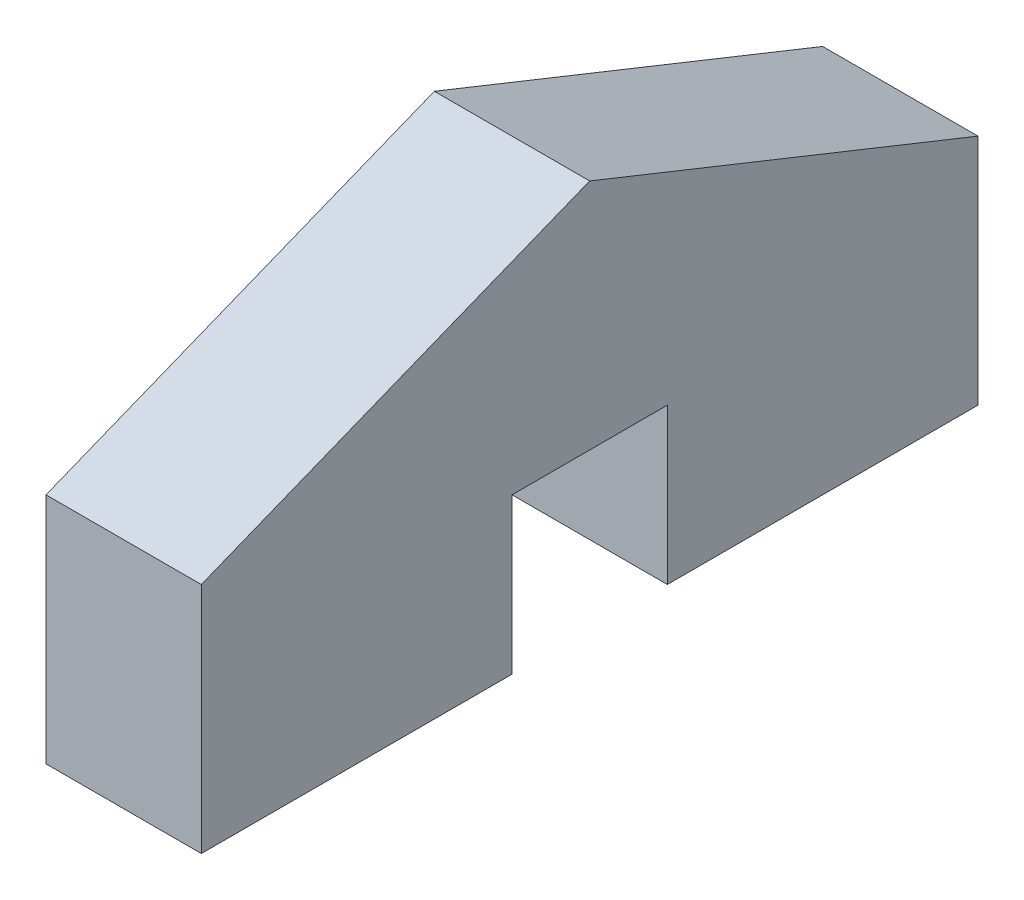
ISO-10303-21;
HEADER;
FILE_DESCRIPTION(('STEP AP214'),'2;1');
FILE_NAME('part.step','',(''),(''),'','','');
FILE_SCHEMA(('AUTOMOTIVE_DESIGN { 1 0 10303 214 1 1 1 1 }'));
ENDSEC;
DATA;
#1=APPLICATION_CONTEXT('core data for automotive mechanical design processes');
#2=APPLICATION_PROTOCOL_DEFINITION('international standard','automotive_design',2000,#1);
#3=PRODUCT_CONTEXT('',#1,'mechanical');
#4=PRODUCT('Part','Part','',(#3));
#5=PRODUCT_RELATED_PRODUCT_CATEGORY('part','',(#4));
#6=PRODUCT_DEFINITION_FORMATION('','',#4);
#7=PRODUCT_DEFINITION_CONTEXT('part definition',#1,'design');
#8=PRODUCT_DEFINITION('design','',#6,#7);
#9=PRODUCT_DEFINITION_SHAPE('','',#8);
#10=(LENGTH_UNIT() NAMED_UNIT(*) SI_UNIT(.MILLI.,.METRE.));
#11=(NAMED_UNIT(*) PLANE_ANGLE_UNIT() SI_UNIT($,.RADIAN.));
#12=(NAMED_UNIT(*) SI_UNIT($,.STERADIAN.) SOLID_ANGLE_UNIT());
#13=UNCERTAINTY_MEASURE_WITH_UNIT(LENGTH_MEASURE(1.E-05),#10,'distance_accuracy_value','');
#14=(GEOMETRIC_REPRESENTATION_CONTEXT(3) GLOBAL_UNCERTAINTY_ASSIGNED_CONTEXT((#13)) GLOBAL_UNIT_ASSIGNED_CONTEXT((#10,
#11,#12)) REPRESENTATION_CONTEXT('',''));
#15=CARTESIAN_POINT('',(0.,0.,0.));
#16=DIRECTION('',(0.,0.,1.));
#17=DIRECTION('',(1.,0.,0.));
#18=AXIS2_PLACEMENT_3D('',#15,#16,#17);
#19=CARTESIAN_POINT('',(20.,0.,0.));
#20=DIRECTION('',(0.,0.,-1.));
#21=DIRECTION('',(-1.,0.,0.));
#22=AXIS2_PLACEMENT_3D('',#19,#20,#21);
#23=PLANE('',#22);
#24=DIRECTION('',(0.,-1.,0.));
#25=VECTOR('',#24,1.);
#26=CARTESIAN_POINT('',(0.,0.,0.));
#27=LINE('',#26,#25);
#28=CARTESIAN_POINT('',(0.,30.,0.));
#29=VERTEX_POINT('',#28);
#30=CARTESIAN_POINT('',(0.,0.,0.));
#31=VERTEX_POINT('',#30);
#32=EDGE_CURVE('E134',#29,#31,#27,.T.);
#33=ORIENTED_EDGE('',*,*,#32,.T.);
#34=DIRECTION('',(-1.,0.,0.));
#35=VECTOR('',#34,1.);
#36=CARTESIAN_POINT('',(20.,0.,0.));
#37=LINE('',#36,#35);
#38=CARTESIAN_POINT('',(20.,0.,0.));
#39=VERTEX_POINT('',#38);
#40=EDGE_CURVE('E11',#39,#31,#37,.T.);
#41=ORIENTED_EDGE('',*,*,#40,.F.);
#42=DIRECTION('',(0.,-1.,0.));
#43=VECTOR('',#42,1.);
#44=CARTESIAN_POINT('',(20.,0.,0.));
#45=LINE('',#44,#43);
#46=CARTESIAN_POINT('',(20.,30.,0.));
#47=VERTEX_POINT('',#46);
#48=EDGE_CURVE('E150',#47,#39,#45,.T.);
#49=ORIENTED_EDGE('',*,*,#48,.F.);
#50=DIRECTION('',(-1.,0.,0.));
#51=VECTOR('',#50,1.);
#52=CARTESIAN_POINT('',(20.,30.,0.));
#53=LINE('',#52,#51);
#54=EDGE_CURVE('E130',#47,#29,#53,.T.);
#55=ORIENTED_EDGE('',*,*,#54,.T.);
#56=EDGE_LOOP('',(#33,#41,#49,#55));
#57=FACE_BOUND('',#56,.T.);
#58=ADVANCED_FACE('F32',(#57),#23,.F.);
#59=CARTESIAN_POINT('',(20.,0.,0.));
#60=DIRECTION('',(0.,1.,0.));
#61=DIRECTION('',(0.,0.,1.));
#62=AXIS2_PLACEMENT_3D('',#59,#60,#61);
#63=PLANE('',#62);
#64=DIRECTION('',(0.,0.,-1.));
#65=VECTOR('',#64,1.);
#66=CARTESIAN_POINT('',(0.,0.,0.));
#67=LINE('',#66,#65);
#68=CARTESIAN_POINT('',(0.,0.,-40.));
#69=VERTEX_POINT('',#68);
#70=EDGE_CURVE('E137',#31,#69,#67,.T.);
#71=ORIENTED_EDGE('',*,*,#70,.T.);
#72=DIRECTION('',(-1.,0.,0.));
#73=VECTOR('',#72,1.);
#74=CARTESIAN_POINT('',(20.,0.,-40.));
#75=LINE('',#74,#73);
#76=CARTESIAN_POINT('',(20.,0.,-40.));
#77=VERTEX_POINT('',#76);
#78=EDGE_CURVE('E40',#77,#69,#75,.T.);
#79=ORIENTED_EDGE('',*,*,#78,.F.);
#80=DIRECTION('',(0.,0.,-1.));
#81=VECTOR('',#80,1.);
#82=CARTESIAN_POINT('',(20.,0.,0.));
#83=LINE('',#82,#81);
#84=EDGE_CURVE('E94',#39,#77,#83,.T.);
#85=ORIENTED_EDGE('',*,*,#84,.F.);
#86=ORIENTED_EDGE('',*,*,#40,.T.);
#87=EDGE_LOOP('',(#71,#79,#85,#86));
#88=FACE_BOUND('',#87,.T.);
#89=ADVANCED_FACE('F193',(#88),#63,.F.);
#90=CARTESIAN_POINT('',(20.,0.,-40.));
#91=DIRECTION('',(0.,0.,1.));
#92=DIRECTION('',(1.,0.,0.));
#93=AXIS2_PLACEMENT_3D('',#90,#91,#92);
#94=PLANE('',#93);
#95=DIRECTION('',(0.,1.,0.));
#96=VECTOR('',#95,1.);
#97=CARTESIAN_POINT('',(0.,0.,-40.));
#98=LINE('',#97,#96);
#99=CARTESIAN_POINT('',(0.,20.,-40.));
#100=VERTEX_POINT('',#99);
#101=EDGE_CURVE('E139',#69,#100,#98,.T.);
#102=ORIENTED_EDGE('',*,*,#101,.T.);
#103=DIRECTION('',(-1.,0.,0.));
#104=VECTOR('',#103,1.);
#105=CARTESIAN_POINT('',(20.,20.,-40.));
#106=LINE('',#105,#104);
#107=CARTESIAN_POINT('',(20.,20.,-40.));
#108=VERTEX_POINT('',#107);
#109=EDGE_CURVE('E160',#108,#100,#106,.T.);
#110=ORIENTED_EDGE('',*,*,#109,.F.);
#111=DIRECTION('',(0.,1.,0.));
#112=VECTOR('',#111,1.);
#113=CARTESIAN_POINT('',(20.,0.,-40.));
#114=LINE('',#113,#112);
#115=EDGE_CURVE('E168',#77,#108,#114,.T.);
#116=ORIENTED_EDGE('',*,*,#115,.F.);
#117=ORIENTED_EDGE('',*,*,#78,.T.);
#118=EDGE_LOOP('',(#102,#110,#116,#117));
#119=FACE_BOUND('',#118,.T.);
#120=ADVANCED_FACE('F166',(#119),#94,.F.);
#121=CARTESIAN_POINT('',(20.,20.,-40.));
#122=DIRECTION('',(0.,1.,0.));
#123=DIRECTION('',(0.,0.,1.));
#124=AXIS2_PLACEMENT_3D('',#121,#122,#123);
#125=PLANE('',#124);
#126=DIRECTION('',(0.,0.,-1.));
#127=VECTOR('',#126,1.);
#128=CARTESIAN_POINT('',(0.,20.,-40.));
#129=LINE('',#128,#127);
#130=CARTESIAN_POINT('',(0.,20.,-60.));
#131=VERTEX_POINT('',#130);
#132=EDGE_CURVE('E141',#100,#131,#129,.T.);
#133=ORIENTED_EDGE('',*,*,#132,.T.);
#134=DIRECTION('',(-1.,0.,0.));
#135=VECTOR('',#134,1.);
#136=CARTESIAN_POINT('',(20.,20.,-60.));
#137=LINE('',#136,#135);
#138=CARTESIAN_POINT('',(20.,20.,-60.));
#139=VERTEX_POINT('',#138);
#140=EDGE_CURVE('E157',#139,#131,#137,.T.);
#141=ORIENTED_EDGE('',*,*,#140,.F.);
#142=DIRECTION('',(0.,0.,-1.));
#143=VECTOR('',#142,1.);
#144=CARTESIAN_POINT('',(20.,20.,-40.));
#145=LINE('',#144,#143);
#146=EDGE_CURVE('E184',#108,#139,#145,.T.);
#147=ORIENTED_EDGE('',*,*,#146,.F.);
#148=ORIENTED_EDGE('',*,*,#109,.T.);
#149=EDGE_LOOP('',(#133,#141,#147,#148));
#150=FACE_BOUND('',#149,.T.);
#151=ADVANCED_FACE('F177',(#150),#125,.F.);
#152=CARTESIAN_POINT('',(20.,0.,-60.));
#153=DIRECTION('',(0.,0.,-1.));
#154=DIRECTION('',(-1.,0.,0.));
#155=AXIS2_PLACEMENT_3D('',#152,#153,#154);
#156=PLANE('',#155);
#157=DIRECTION('',(0.,-1.,0.));
#158=VECTOR('',#157,1.);
#159=CARTESIAN_POINT('',(0.,0.,-60.));
#160=LINE('',#159,#158);
#161=CARTESIAN_POINT('',(0.,0.,-60.));
#162=VERTEX_POINT('',#161);
#163=EDGE_CURVE('E143',#131,#162,#160,.T.);
#164=ORIENTED_EDGE('',*,*,#163,.T.);
#165=DIRECTION('',(-1.,0.,0.));
#166=VECTOR('',#165,1.);
#167=CARTESIAN_POINT('',(20.,0.,-60.));
#168=LINE('',#167,#166);
#169=CARTESIAN_POINT('',(20.,0.,-60.));
#170=VERTEX_POINT('',#169);
#171=EDGE_CURVE('E154',#170,#162,#168,.T.);
#172=ORIENTED_EDGE('',*,*,#171,.F.);
#173=DIRECTION('',(0.,-1.,0.));
#174=VECTOR('',#173,1.);
#175=CARTESIAN_POINT('',(20.,0.,-60.));
#176=LINE('',#175,#174);
#177=EDGE_CURVE('E183',#139,#170,#176,.T.);
#178=ORIENTED_EDGE('',*,*,#177,.F.);
#179=ORIENTED_EDGE('',*,*,#140,.T.);
#180=EDGE_LOOP('',(#164,#172,#178,#179));
#181=FACE_BOUND('',#180,.T.);
#182=ADVANCED_FACE('F181',(#181),#156,.F.);
#183=CARTESIAN_POINT('',(20.,0.,-60.));
#184=DIRECTION('',(0.,1.,0.));
#185=DIRECTION('',(0.,0.,1.));
#186=AXIS2_PLACEMENT_3D('',#183,#184,#185);
#187=PLANE('',#186);
#188=DIRECTION('',(0.,0.,-1.));
#189=VECTOR('',#188,1.);
#190=CARTESIAN_POINT('',(0.,0.,-60.));
#191=LINE('',#190,#189);
#192=CARTESIAN_POINT('',(0.,0.,-100.));
#193=VERTEX_POINT('',#192);
#194=EDGE_CURVE('E145',#162,#193,#191,.T.);
#195=ORIENTED_EDGE('',*,*,#194,.T.);
#196=DIRECTION('',(-1.,0.,0.));
#197=VECTOR('',#196,1.);
#198=CARTESIAN_POINT('',(20.,0.,-100.));
#199=LINE('',#198,#197);
#200=CARTESIAN_POINT('',(20.,0.,-100.));
#201=VERTEX_POINT('',#200);
#202=EDGE_CURVE('E125',#201,#193,#199,.T.);
#203=ORIENTED_EDGE('',*,*,#202,.F.);
#204=DIRECTION('',(0.,0.,-1.));
#205=VECTOR('',#204,1.);
#206=CARTESIAN_POINT('',(20.,0.,-60.));
#207=LINE('',#206,#205);
#208=EDGE_CURVE('E116',#170,#201,#207,.T.);
#209=ORIENTED_EDGE('',*,*,#208,.F.);
#210=ORIENTED_EDGE('',*,*,#171,.T.);
#211=EDGE_LOOP('',(#195,#203,#209,#210));
#212=FACE_BOUND('',#211,.T.);
#213=ADVANCED_FACE('F205',(#212),#187,.F.);
#214=CARTESIAN_POINT('',(20.,0.,-100.));
#215=DIRECTION('',(0.,0.,1.));
#216=DIRECTION('',(1.,0.,0.));
#217=AXIS2_PLACEMENT_3D('',#214,#215,#216);
#218=PLANE('',#217);
#219=DIRECTION('',(0.,1.,0.));
#220=VECTOR('',#219,1.);
#221=CARTESIAN_POINT('',(0.,0.,-100.));
#222=LINE('',#221,#220);
#223=CARTESIAN_POINT('',(0.,30.,-100.));
#224=VERTEX_POINT('',#223);
#225=EDGE_CURVE('E124',#193,#224,#222,.T.);
#226=ORIENTED_EDGE('',*,*,#225,.T.);
#227=DIRECTION('',(-1.,0.,0.));
#228=VECTOR('',#227,1.);
#229=CARTESIAN_POINT('',(20.,30.,-100.));
#230=LINE('',#229,#228);
#231=CARTESIAN_POINT('',(20.,30.,-100.));
#232=VERTEX_POINT('',#231);
#233=EDGE_CURVE('E121',#232,#224,#230,.T.);
#234=ORIENTED_EDGE('',*,*,#233,.F.);
#235=DIRECTION('',(0.,1.,0.));
#236=VECTOR('',#235,1.);
#237=CARTESIAN_POINT('',(20.,0.,-100.));
#238=LINE('',#237,#236);
#239=EDGE_CURVE('E110',#201,#232,#238,.T.);
#240=ORIENTED_EDGE('',*,*,#239,.F.);
#241=ORIENTED_EDGE('',*,*,#202,.T.);
#242=EDGE_LOOP('',(#226,#234,#240,#241));
#243=FACE_BOUND('',#242,.T.);
#244=ADVANCED_FACE('F122',(#243),#218,.F.);
#245=CARTESIAN_POINT('',(20.,50.,-50.));
#246=DIRECTION('',(0.,-0.928476690885259,0.371390676354104));
#247=DIRECTION('',(0.,-0.371390676354104,-0.928476690885259));
#248=AXIS2_PLACEMENT_3D('',#245,#246,#247);
#249=PLANE('',#248);
#250=DIRECTION('',(0.,0.371390676354104,0.928476690885259));
#251=VECTOR('',#250,1.);
#252=CARTESIAN_POINT('',(0.,50.,-50.));
#253=LINE('',#252,#251);
#254=CARTESIAN_POINT('',(0.,50.,-50.));
#255=VERTEX_POINT('',#254);
#256=EDGE_CURVE('E80',#224,#255,#253,.T.);
#257=ORIENTED_EDGE('',*,*,#256,.T.);
#258=DIRECTION('',(-1.,0.,0.));
#259=VECTOR('',#258,1.);
#260=CARTESIAN_POINT('',(20.,50.,-50.));
#261=LINE('',#260,#259);
#262=CARTESIAN_POINT('',(20.,50.,-50.));
#263=VERTEX_POINT('',#262);
#264=EDGE_CURVE('E126',#263,#255,#261,.T.);
#265=ORIENTED_EDGE('',*,*,#264,.F.);
#266=DIRECTION('',(0.,0.371390676354104,0.928476690885259));
#267=VECTOR('',#266,1.);
#268=CARTESIAN_POINT('',(20.,50.,-50.));
#269=LINE('',#268,#267);
#270=EDGE_CURVE('E114',#232,#263,#269,.T.);
#271=ORIENTED_EDGE('',*,*,#270,.F.);
#272=ORIENTED_EDGE('',*,*,#233,.T.);
#273=EDGE_LOOP('',(#257,#265,#271,#272));
#274=FACE_BOUND('',#273,.T.);
#275=ADVANCED_FACE('F128',(#274),#249,.F.);
#276=CARTESIAN_POINT('',(20.,50.,-50.));
#277=DIRECTION('',(0.,-0.928476690885259,-0.371390676354104));
#278=DIRECTION('',(0.,0.371390676354104,-0.928476690885259));
#279=AXIS2_PLACEMENT_3D('',#276,#277,#278);
#280=PLANE('',#279);
#281=DIRECTION('',(0.,-0.371390676354104,0.928476690885259));
#282=VECTOR('',#281,1.);
#283=CARTESIAN_POINT('',(0.,50.,-50.));
#284=LINE('',#283,#282);
#285=EDGE_CURVE('E86',#255,#29,#284,.T.);
#286=ORIENTED_EDGE('',*,*,#285,.T.);
#287=ORIENTED_EDGE('',*,*,#54,.F.);
#288=DIRECTION('',(0.,-0.371390676354104,0.928476690885259));
#289=VECTOR('',#288,1.);
#290=CARTESIAN_POINT('',(20.,50.,-50.));
#291=LINE('',#290,#289);
#292=EDGE_CURVE('E48',#263,#47,#291,.T.);
#293=ORIENTED_EDGE('',*,*,#292,.F.);
#294=ORIENTED_EDGE('',*,*,#264,.T.);
#295=EDGE_LOOP('',(#286,#287,#293,#294));
#296=FACE_BOUND('',#295,.T.);
#297=ADVANCED_FACE('F213',(#296),#280,.F.);
#298=CARTESIAN_POINT('',(20.,0.,0.));
#299=DIRECTION('',(-1.,0.,0.));
#300=DIRECTION('',(0.,0.,1.));
#301=AXIS2_PLACEMENT_3D('',#298,#299,#300);
#302=PLANE('',#301);
#303=ORIENTED_EDGE('',*,*,#48,.T.);
#304=ORIENTED_EDGE('',*,*,#84,.T.);
#305=ORIENTED_EDGE('',*,*,#115,.T.);
#306=ORIENTED_EDGE('',*,*,#146,.T.);
#307=ORIENTED_EDGE('',*,*,#177,.T.);
#308=ORIENTED_EDGE('',*,*,#208,.T.);
#309=ORIENTED_EDGE('',*,*,#239,.T.);
#310=ORIENTED_EDGE('',*,*,#270,.T.);
#311=ORIENTED_EDGE('',*,*,#292,.T.);
#312=EDGE_LOOP('',(#303,#304,#305,#306,#307,#308,#309,#310,#311));
#313=FACE_BOUND('',#312,.T.);
#314=ADVANCED_FACE('F112',(#313),#302,.F.);
#315=CARTESIAN_POINT('',(0.,0.,0.));
#316=DIRECTION('',(-1.,0.,0.));
#317=DIRECTION('',(0.,0.,1.));
#318=AXIS2_PLACEMENT_3D('',#315,#316,#317);
#319=PLANE('',#318);
#320=ORIENTED_EDGE('',*,*,#32,.F.);
#321=ORIENTED_EDGE('',*,*,#285,.F.);
#322=ORIENTED_EDGE('',*,*,#256,.F.);
#323=ORIENTED_EDGE('',*,*,#225,.F.);
#324=ORIENTED_EDGE('',*,*,#194,.F.);
#325=ORIENTED_EDGE('',*,*,#163,.F.);
#326=ORIENTED_EDGE('',*,*,#132,.F.);
#327=ORIENTED_EDGE('',*,*,#101,.F.);
#328=ORIENTED_EDGE('',*,*,#70,.F.);
#329=EDGE_LOOP('',(#320,#321,#322,#323,#324,#325,#326,#327,#328));
#330=FACE_BOUND('',#329,.T.);
#331=ADVANCED_FACE('F172',(#330),#319,.T.);
#332=CLOSED_SHELL('',(#58,#89,#120,#151,#182,#213,#244,#275,#297,#314,#331));
#333=MANIFOLD_SOLID_BREP('B2',#332);
#334=ADVANCED_BREP_SHAPE_REPRESENTATION('',(#18,#333),#14);
#335=SHAPE_DEFINITION_REPRESENTATION(#9,#334);
ENDSEC;
END-ISO-10303-21;
